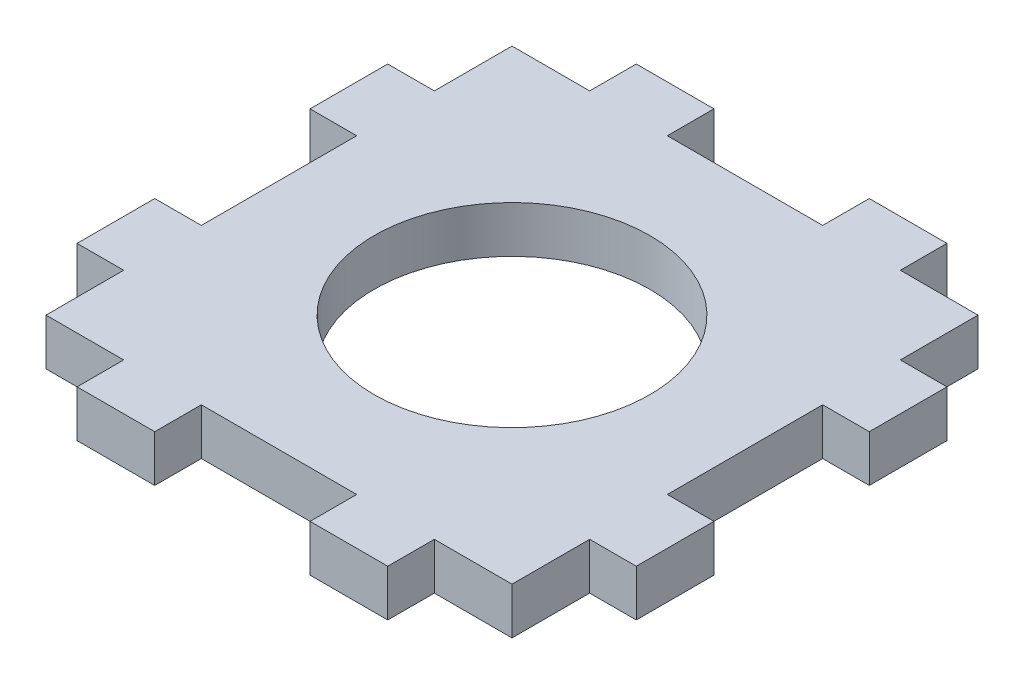
ISO-10303-21;
HEADER;
FILE_DESCRIPTION(('STEP AP214'),'2;1');
FILE_NAME('part.step','',(''),(''),'','','');
FILE_SCHEMA(('AUTOMOTIVE_DESIGN { 1 0 10303 214 1 1 1 1 }'));
ENDSEC;
DATA;
#1=APPLICATION_CONTEXT('core data for automotive mechanical design processes');
#2=APPLICATION_PROTOCOL_DEFINITION('international standard','automotive_design',2000,#1);
#3=PRODUCT_CONTEXT('',#1,'mechanical');
#4=PRODUCT('Part','Part','',(#3));
#5=PRODUCT_RELATED_PRODUCT_CATEGORY('part','',(#4));
#6=PRODUCT_DEFINITION_FORMATION('','',#4);
#7=PRODUCT_DEFINITION_CONTEXT('part definition',#1,'design');
#8=PRODUCT_DEFINITION('design','',#6,#7);
#9=PRODUCT_DEFINITION_SHAPE('','',#8);
#10=(LENGTH_UNIT() NAMED_UNIT(*) SI_UNIT(.MILLI.,.METRE.));
#11=(NAMED_UNIT(*) PLANE_ANGLE_UNIT() SI_UNIT($,.RADIAN.));
#12=(NAMED_UNIT(*) SI_UNIT($,.STERADIAN.) SOLID_ANGLE_UNIT());
#13=UNCERTAINTY_MEASURE_WITH_UNIT(LENGTH_MEASURE(1.E-05),#10,'distance_accuracy_value','');
#14=(GEOMETRIC_REPRESENTATION_CONTEXT(3) GLOBAL_UNCERTAINTY_ASSIGNED_CONTEXT((#13)) GLOBAL_UNIT_ASSIGNED_CONTEXT((#10,
#11,#12)) REPRESENTATION_CONTEXT('',''));
#15=CARTESIAN_POINT('',(0.,0.,0.));
#16=DIRECTION('',(0.,0.,1.));
#17=DIRECTION('',(1.,0.,0.));
#18=AXIS2_PLACEMENT_3D('',#15,#16,#17);
#19=CARTESIAN_POINT('',(30.,6.,0.));
#20=DIRECTION('',(1.,0.,0.));
#21=DIRECTION('',(0.,0.,-1.));
#22=AXIS2_PLACEMENT_3D('',#19,#20,#21);
#23=PLANE('',#22);
#24=DIRECTION('',(0.,0.,1.));
#25=VECTOR('',#24,1.);
#26=CARTESIAN_POINT('',(30.,0.,0.));
#27=LINE('',#26,#25);
#28=CARTESIAN_POINT('',(30.,0.,-30.));
#29=VERTEX_POINT('',#28);
#30=CARTESIAN_POINT('',(30.,0.,-19.9999999999997));
#31=VERTEX_POINT('',#30);
#32=EDGE_CURVE('E302',#29,#31,#27,.T.);
#33=ORIENTED_EDGE('',*,*,#32,.F.);
#34=DIRECTION('',(0.,-1.,0.));
#35=VECTOR('',#34,1.);
#36=CARTESIAN_POINT('',(30.,6.,-30.));
#37=LINE('',#36,#35);
#38=CARTESIAN_POINT('',(30.,6.,-30.));
#39=VERTEX_POINT('',#38);
#40=EDGE_CURVE('E11',#39,#29,#37,.T.);
#41=ORIENTED_EDGE('',*,*,#40,.F.);
#42=DIRECTION('',(0.,0.,1.));
#43=VECTOR('',#42,1.);
#44=CARTESIAN_POINT('',(30.,6.,0.));
#45=LINE('',#44,#43);
#46=CARTESIAN_POINT('',(30.,6.,-19.9999999999997));
#47=VERTEX_POINT('',#46);
#48=EDGE_CURVE('E611',#39,#47,#45,.T.);
#49=ORIENTED_EDGE('',*,*,#48,.T.);
#50=DIRECTION('',(0.,-1.,0.));
#51=VECTOR('',#50,1.);
#52=CARTESIAN_POINT('',(30.,6.,-19.9999999999997));
#53=LINE('',#52,#51);
#54=EDGE_CURVE('E54',#47,#31,#53,.T.);
#55=ORIENTED_EDGE('',*,*,#54,.T.);
#56=EDGE_LOOP('',(#33,#41,#49,#55));
#57=FACE_BOUND('',#56,.T.);
#58=ADVANCED_FACE('F37',(#57),#23,.T.);
#59=CARTESIAN_POINT('',(0.,6.,-30.));
#60=DIRECTION('',(0.,0.,-1.));
#61=DIRECTION('',(-1.,0.,0.));
#62=AXIS2_PLACEMENT_3D('',#59,#60,#61);
#63=PLANE('',#62);
#64=DIRECTION('',(1.,0.,0.));
#65=VECTOR('',#64,1.);
#66=CARTESIAN_POINT('',(0.,0.,-30.));
#67=LINE('',#66,#65);
#68=CARTESIAN_POINT('',(20.0000000000002,0.,-30.));
#69=VERTEX_POINT('',#68);
#70=EDGE_CURVE('E304',#69,#29,#67,.T.);
#71=ORIENTED_EDGE('',*,*,#70,.F.);
#72=DIRECTION('',(0.,-1.,0.));
#73=VECTOR('',#72,1.);
#74=CARTESIAN_POINT('',(20.0000000000002,6.,-30.));
#75=LINE('',#74,#73);
#76=CARTESIAN_POINT('',(20.0000000000002,6.,-30.));
#77=VERTEX_POINT('',#76);
#78=EDGE_CURVE('E46',#77,#69,#75,.T.);
#79=ORIENTED_EDGE('',*,*,#78,.F.);
#80=DIRECTION('',(1.,0.,0.));
#81=VECTOR('',#80,1.);
#82=CARTESIAN_POINT('',(0.,6.,-30.));
#83=LINE('',#82,#81);
#84=EDGE_CURVE('E476',#77,#39,#83,.T.);
#85=ORIENTED_EDGE('',*,*,#84,.T.);
#86=ORIENTED_EDGE('',*,*,#40,.T.);
#87=EDGE_LOOP('',(#71,#79,#85,#86));
#88=FACE_BOUND('',#87,.T.);
#89=ADVANCED_FACE('F475',(#88),#63,.T.);
#90=CARTESIAN_POINT('',(19.9999999999992,6.,6.93889390390704E-13));
#91=DIRECTION('',(-1.,0.,0.));
#92=DIRECTION('',(0.,0.,1.));
#93=AXIS2_PLACEMENT_3D('',#90,#91,#92);
#94=PLANE('',#93);
#95=DIRECTION('',(0.,0.,-1.));
#96=VECTOR('',#95,1.);
#97=CARTESIAN_POINT('',(19.9999999999992,0.,6.93889390390704E-13));
#98=LINE('',#97,#96);
#99=CARTESIAN_POINT('',(20.0000000000004,0.,-35.9999999999998));
#100=VERTEX_POINT('',#99);
#101=EDGE_CURVE('E309',#69,#100,#98,.T.);
#102=ORIENTED_EDGE('',*,*,#101,.T.);
#103=DIRECTION('',(0.,-1.,0.));
#104=VECTOR('',#103,1.);
#105=CARTESIAN_POINT('',(20.0000000000004,6.,-35.9999999999998));
#106=LINE('',#105,#104);
#107=CARTESIAN_POINT('',(20.0000000000004,6.,-35.9999999999998));
#108=VERTEX_POINT('',#107);
#109=EDGE_CURVE('E460',#108,#100,#106,.T.);
#110=ORIENTED_EDGE('',*,*,#109,.F.);
#111=DIRECTION('',(0.,0.,-1.));
#112=VECTOR('',#111,1.);
#113=CARTESIAN_POINT('',(19.9999999999992,6.,6.93889390390704E-13));
#114=LINE('',#113,#112);
#115=EDGE_CURVE('E468',#77,#108,#114,.T.);
#116=ORIENTED_EDGE('',*,*,#115,.F.);
#117=ORIENTED_EDGE('',*,*,#78,.T.);
#118=EDGE_LOOP('',(#102,#110,#116,#117));
#119=FACE_BOUND('',#118,.T.);
#120=ADVANCED_FACE('F465',(#119),#94,.F.);
#121=CARTESIAN_POINT('',(0.,6.,-35.9999999999998));
#122=DIRECTION('',(0.,0.,1.));
#123=DIRECTION('',(1.,0.,0.));
#124=AXIS2_PLACEMENT_3D('',#121,#122,#123);
#125=PLANE('',#124);
#126=DIRECTION('',(-1.,0.,0.));
#127=VECTOR('',#126,1.);
#128=CARTESIAN_POINT('',(0.,0.,-35.9999999999998));
#129=LINE('',#128,#127);
#130=CARTESIAN_POINT('',(10.0000000000004,0.,-35.9999999999998));
#131=VERTEX_POINT('',#130);
#132=EDGE_CURVE('E314',#100,#131,#129,.T.);
#133=ORIENTED_EDGE('',*,*,#132,.T.);
#134=DIRECTION('',(0.,-1.,0.));
#135=VECTOR('',#134,1.);
#136=CARTESIAN_POINT('',(10.0000000000004,6.,-35.9999999999998));
#137=LINE('',#136,#135);
#138=CARTESIAN_POINT('',(10.0000000000004,6.,-35.9999999999998));
#139=VERTEX_POINT('',#138);
#140=EDGE_CURVE('E458',#139,#131,#137,.T.);
#141=ORIENTED_EDGE('',*,*,#140,.F.);
#142=DIRECTION('',(-1.,0.,0.));
#143=VECTOR('',#142,1.);
#144=CARTESIAN_POINT('',(0.,6.,-35.9999999999998));
#145=LINE('',#144,#143);
#146=EDGE_CURVE('E608',#108,#139,#145,.T.);
#147=ORIENTED_EDGE('',*,*,#146,.F.);
#148=ORIENTED_EDGE('',*,*,#109,.T.);
#149=EDGE_LOOP('',(#133,#141,#147,#148));
#150=FACE_BOUND('',#149,.T.);
#151=ADVANCED_FACE('F607',(#150),#125,.F.);
#152=CARTESIAN_POINT('',(9.99999999999917,6.,3.44053489402047E-13));
#153=DIRECTION('',(-1.,0.,0.));
#154=DIRECTION('',(0.,0.,1.));
#155=AXIS2_PLACEMENT_3D('',#152,#153,#154);
#156=PLANE('',#155);
#157=DIRECTION('',(0.,0.,-1.));
#158=VECTOR('',#157,1.);
#159=CARTESIAN_POINT('',(9.99999999999917,0.,3.44053489402047E-13));
#160=LINE('',#159,#158);
#161=CARTESIAN_POINT('',(10.0000000000002,0.,-30.));
#162=VERTEX_POINT('',#161);
#163=EDGE_CURVE('E317',#162,#131,#160,.T.);
#164=ORIENTED_EDGE('',*,*,#163,.F.);
#165=DIRECTION('',(0.,-1.,0.));
#166=VECTOR('',#165,1.);
#167=CARTESIAN_POINT('',(10.0000000000002,6.,-30.));
#168=LINE('',#167,#166);
#169=CARTESIAN_POINT('',(10.0000000000002,6.,-30.));
#170=VERTEX_POINT('',#169);
#171=EDGE_CURVE('E456',#170,#162,#168,.T.);
#172=ORIENTED_EDGE('',*,*,#171,.F.);
#173=DIRECTION('',(0.,0.,-1.));
#174=VECTOR('',#173,1.);
#175=CARTESIAN_POINT('',(9.99999999999917,6.,3.44053489402047E-13));
#176=LINE('',#175,#174);
#177=EDGE_CURVE('E605',#170,#139,#176,.T.);
#178=ORIENTED_EDGE('',*,*,#177,.T.);
#179=ORIENTED_EDGE('',*,*,#140,.T.);
#180=EDGE_LOOP('',(#164,#172,#178,#179));
#181=FACE_BOUND('',#180,.T.);
#182=ADVANCED_FACE('F603',(#181),#156,.T.);
#183=CARTESIAN_POINT('',(-9.99999999999969,0.,-30.));
#184=VERTEX_POINT('',#183);
#185=EDGE_CURVE('E311',#184,#162,#67,.T.);
#186=ORIENTED_EDGE('',*,*,#185,.F.);
#187=DIRECTION('',(0.,-1.,0.));
#188=VECTOR('',#187,1.);
#189=CARTESIAN_POINT('',(-9.99999999999969,6.,-30.));
#190=LINE('',#189,#188);
#191=CARTESIAN_POINT('',(-9.99999999999969,6.,-30.));
#192=VERTEX_POINT('',#191);
#193=EDGE_CURVE('E454',#192,#184,#190,.T.);
#194=ORIENTED_EDGE('',*,*,#193,.F.);
#195=EDGE_CURVE('E599',#192,#170,#83,.T.);
#196=ORIENTED_EDGE('',*,*,#195,.T.);
#197=ORIENTED_EDGE('',*,*,#171,.T.);
#198=EDGE_LOOP('',(#186,#194,#196,#197));
#199=FACE_BOUND('',#198,.T.);
#200=ADVANCED_FACE('F497',(#199),#63,.T.);
#201=CARTESIAN_POINT('',(-10.0000000000007,6.,-3.15141431469159E-13));
#202=DIRECTION('',(-1.,0.,0.));
#203=DIRECTION('',(0.,0.,1.));
#204=AXIS2_PLACEMENT_3D('',#201,#202,#203);
#205=PLANE('',#204);
#206=DIRECTION('',(0.,0.,-1.));
#207=VECTOR('',#206,1.);
#208=CARTESIAN_POINT('',(-10.0000000000007,0.,-3.15141431469159E-13));
#209=LINE('',#208,#207);
#210=CARTESIAN_POINT('',(-9.9999999999996,0.,-35.9999999999998));
#211=VERTEX_POINT('',#210);
#212=EDGE_CURVE('E320',#184,#211,#209,.T.);
#213=ORIENTED_EDGE('',*,*,#212,.T.);
#214=DIRECTION('',(0.,-1.,0.));
#215=VECTOR('',#214,1.);
#216=CARTESIAN_POINT('',(-9.9999999999996,6.,-35.9999999999998));
#217=LINE('',#216,#215);
#218=CARTESIAN_POINT('',(-9.9999999999996,6.,-35.9999999999998));
#219=VERTEX_POINT('',#218);
#220=EDGE_CURVE('E452',#219,#211,#217,.T.);
#221=ORIENTED_EDGE('',*,*,#220,.F.);
#222=DIRECTION('',(0.,0.,-1.));
#223=VECTOR('',#222,1.);
#224=CARTESIAN_POINT('',(-10.0000000000007,6.,-3.15141431469159E-13));
#225=LINE('',#224,#223);
#226=EDGE_CURVE('E616',#192,#219,#225,.T.);
#227=ORIENTED_EDGE('',*,*,#226,.F.);
#228=ORIENTED_EDGE('',*,*,#193,.T.);
#229=EDGE_LOOP('',(#213,#221,#227,#228));
#230=FACE_BOUND('',#229,.T.);
#231=ADVANCED_FACE('F932',(#230),#205,.F.);
#232=CARTESIAN_POINT('',(0.,6.,-35.9999999999998));
#233=DIRECTION('',(0.,0.,-1.));
#234=DIRECTION('',(-1.,0.,0.));
#235=AXIS2_PLACEMENT_3D('',#232,#233,#234);
#236=PLANE('',#235);
#237=DIRECTION('',(1.,0.,0.));
#238=VECTOR('',#237,1.);
#239=CARTESIAN_POINT('',(0.,0.,-35.9999999999998));
#240=LINE('',#239,#238);
#241=CARTESIAN_POINT('',(-19.9999999999996,0.,-35.9999999999998));
#242=VERTEX_POINT('',#241);
#243=EDGE_CURVE('E323',#242,#211,#240,.T.);
#244=ORIENTED_EDGE('',*,*,#243,.F.);
#245=DIRECTION('',(0.,-1.,0.));
#246=VECTOR('',#245,1.);
#247=CARTESIAN_POINT('',(-19.9999999999996,6.,-35.9999999999998));
#248=LINE('',#247,#246);
#249=CARTESIAN_POINT('',(-19.9999999999996,6.,-35.9999999999998));
#250=VERTEX_POINT('',#249);
#251=EDGE_CURVE('E450',#250,#242,#248,.T.);
#252=ORIENTED_EDGE('',*,*,#251,.F.);
#253=DIRECTION('',(1.,0.,0.));
#254=VECTOR('',#253,1.);
#255=CARTESIAN_POINT('',(0.,6.,-35.9999999999998));
#256=LINE('',#255,#254);
#257=EDGE_CURVE('E618',#250,#219,#256,.T.);
#258=ORIENTED_EDGE('',*,*,#257,.T.);
#259=ORIENTED_EDGE('',*,*,#220,.T.);
#260=EDGE_LOOP('',(#244,#252,#258,#259));
#261=FACE_BOUND('',#260,.T.);
#262=ADVANCED_FACE('F921',(#261),#236,.T.);
#263=CARTESIAN_POINT('',(-20.0000000000008,6.,-6.47630097698073E-13));
#264=DIRECTION('',(-1.,0.,0.));
#265=DIRECTION('',(0.,0.,1.));
#266=AXIS2_PLACEMENT_3D('',#263,#264,#265);
#267=PLANE('',#266);
#268=DIRECTION('',(0.,0.,-1.));
#269=VECTOR('',#268,1.);
#270=CARTESIAN_POINT('',(-20.0000000000008,0.,-6.47630097698073E-13));
#271=LINE('',#270,#269);
#272=CARTESIAN_POINT('',(-19.9999999999997,0.,-30.));
#273=VERTEX_POINT('',#272);
#274=EDGE_CURVE('E326',#273,#242,#271,.T.);
#275=ORIENTED_EDGE('',*,*,#274,.F.);
#276=DIRECTION('',(0.,-1.,0.));
#277=VECTOR('',#276,1.);
#278=CARTESIAN_POINT('',(-19.9999999999997,6.,-30.));
#279=LINE('',#278,#277);
#280=CARTESIAN_POINT('',(-19.9999999999997,6.,-30.));
#281=VERTEX_POINT('',#280);
#282=EDGE_CURVE('E448',#281,#273,#279,.T.);
#283=ORIENTED_EDGE('',*,*,#282,.F.);
#284=DIRECTION('',(0.,0.,-1.));
#285=VECTOR('',#284,1.);
#286=CARTESIAN_POINT('',(-20.0000000000008,6.,-6.47630097698073E-13));
#287=LINE('',#286,#285);
#288=EDGE_CURVE('E621',#281,#250,#287,.T.);
#289=ORIENTED_EDGE('',*,*,#288,.T.);
#290=ORIENTED_EDGE('',*,*,#251,.T.);
#291=EDGE_LOOP('',(#275,#283,#289,#290));
#292=FACE_BOUND('',#291,.T.);
#293=ADVANCED_FACE('F911',(#292),#267,.T.);
#294=CARTESIAN_POINT('',(-30.,0.,-30.));
#295=VERTEX_POINT('',#294);
#296=EDGE_CURVE('E310',#295,#273,#67,.T.);
#297=ORIENTED_EDGE('',*,*,#296,.F.);
#298=DIRECTION('',(0.,-1.,0.));
#299=VECTOR('',#298,1.);
#300=CARTESIAN_POINT('',(-30.,6.,-30.));
#301=LINE('',#300,#299);
#302=CARTESIAN_POINT('',(-30.,6.,-30.));
#303=VERTEX_POINT('',#302);
#304=EDGE_CURVE('E446',#303,#295,#301,.T.);
#305=ORIENTED_EDGE('',*,*,#304,.F.);
#306=EDGE_CURVE('E589',#303,#281,#83,.T.);
#307=ORIENTED_EDGE('',*,*,#306,.T.);
#308=ORIENTED_EDGE('',*,*,#282,.T.);
#309=EDGE_LOOP('',(#297,#305,#307,#308));
#310=FACE_BOUND('',#309,.T.);
#311=ADVANCED_FACE('F498',(#310),#63,.T.);
#312=CARTESIAN_POINT('',(-30.,6.,0.));
#313=DIRECTION('',(1.,0.,0.));
#314=DIRECTION('',(0.,0.,-1.));
#315=AXIS2_PLACEMENT_3D('',#312,#313,#314);
#316=PLANE('',#315);
#317=DIRECTION('',(0.,0.,1.));
#318=VECTOR('',#317,1.);
#319=CARTESIAN_POINT('',(-30.,0.,0.));
#320=LINE('',#319,#318);
#321=CARTESIAN_POINT('',(-30.,0.,-20.0000000000001));
#322=VERTEX_POINT('',#321);
#323=EDGE_CURVE('E329',#295,#322,#320,.T.);
#324=ORIENTED_EDGE('',*,*,#323,.T.);
#325=DIRECTION('',(0.,-1.,0.));
#326=VECTOR('',#325,1.);
#327=CARTESIAN_POINT('',(-30.,6.,-20.0000000000001));
#328=LINE('',#327,#326);
#329=CARTESIAN_POINT('',(-30.,6.,-20.0000000000001));
#330=VERTEX_POINT('',#329);
#331=EDGE_CURVE('E443',#330,#322,#328,.T.);
#332=ORIENTED_EDGE('',*,*,#331,.F.);
#333=DIRECTION('',(0.,0.,1.));
#334=VECTOR('',#333,1.);
#335=CARTESIAN_POINT('',(-30.,6.,0.));
#336=LINE('',#335,#334);
#337=EDGE_CURVE('E585',#303,#330,#336,.T.);
#338=ORIENTED_EDGE('',*,*,#337,.F.);
#339=ORIENTED_EDGE('',*,*,#304,.T.);
#340=EDGE_LOOP('',(#324,#332,#338,#339));
#341=FACE_BOUND('',#340,.T.);
#342=ADVANCED_FACE('F584',(#341),#316,.F.);
#343=CARTESIAN_POINT('',(0.,6.,-20.0000000000002));
#344=DIRECTION('',(0.,0.,1.));
#345=DIRECTION('',(1.,0.,0.));
#346=AXIS2_PLACEMENT_3D('',#343,#344,#345);
#347=PLANE('',#346);
#348=DIRECTION('',(-1.,0.,0.));
#349=VECTOR('',#348,1.);
#350=CARTESIAN_POINT('',(0.,0.,-20.0000000000002));
#351=LINE('',#350,#349);
#352=CARTESIAN_POINT('',(-35.9999999999997,0.,-20.0000000000001));
#353=VERTEX_POINT('',#352);
#354=EDGE_CURVE('E332',#322,#353,#351,.T.);
#355=ORIENTED_EDGE('',*,*,#354,.T.);
#356=DIRECTION('',(0.,-1.,0.));
#357=VECTOR('',#356,1.);
#358=CARTESIAN_POINT('',(-35.9999999999997,6.,-20.0000000000001));
#359=LINE('',#358,#357);
#360=CARTESIAN_POINT('',(-35.9999999999997,6.,-20.0000000000001));
#361=VERTEX_POINT('',#360);
#362=EDGE_CURVE('E440',#361,#353,#359,.T.);
#363=ORIENTED_EDGE('',*,*,#362,.F.);
#364=DIRECTION('',(-1.,0.,0.));
#365=VECTOR('',#364,1.);
#366=CARTESIAN_POINT('',(0.,6.,-20.0000000000002));
#367=LINE('',#366,#365);
#368=EDGE_CURVE('E580',#330,#361,#367,.T.);
#369=ORIENTED_EDGE('',*,*,#368,.F.);
#370=ORIENTED_EDGE('',*,*,#331,.T.);
#371=EDGE_LOOP('',(#355,#363,#369,#370));
#372=FACE_BOUND('',#371,.T.);
#373=ADVANCED_FACE('F578',(#372),#347,.F.);
#374=CARTESIAN_POINT('',(-35.9999999999997,6.,0.));
#375=DIRECTION('',(1.,0.,0.));
#376=DIRECTION('',(0.,0.,-1.));
#377=AXIS2_PLACEMENT_3D('',#374,#375,#376);
#378=PLANE('',#377);
#379=DIRECTION('',(0.,0.,1.));
#380=VECTOR('',#379,1.);
#381=CARTESIAN_POINT('',(-35.9999999999997,0.,0.));
#382=LINE('',#381,#380);
#383=CARTESIAN_POINT('',(-35.9999999999997,0.,-10.0000000000001));
#384=VERTEX_POINT('',#383);
#385=EDGE_CURVE('E337',#353,#384,#382,.T.);
#386=ORIENTED_EDGE('',*,*,#385,.T.);
#387=DIRECTION('',(0.,-1.,0.));
#388=VECTOR('',#387,1.);
#389=CARTESIAN_POINT('',(-35.9999999999997,6.,-10.0000000000001));
#390=LINE('',#389,#388);
#391=CARTESIAN_POINT('',(-35.9999999999997,6.,-10.0000000000001));
#392=VERTEX_POINT('',#391);
#393=EDGE_CURVE('E438',#392,#384,#390,.T.);
#394=ORIENTED_EDGE('',*,*,#393,.F.);
#395=DIRECTION('',(0.,0.,1.));
#396=VECTOR('',#395,1.);
#397=CARTESIAN_POINT('',(-35.9999999999997,6.,0.));
#398=LINE('',#397,#396);
#399=EDGE_CURVE('E628',#361,#392,#398,.T.);
#400=ORIENTED_EDGE('',*,*,#399,.F.);
#401=ORIENTED_EDGE('',*,*,#362,.T.);
#402=EDGE_LOOP('',(#386,#394,#400,#401));
#403=FACE_BOUND('',#402,.T.);
#404=ADVANCED_FACE('F571',(#403),#378,.F.);
#405=CARTESIAN_POINT('',(0.,6.,-10.0000000000002));
#406=DIRECTION('',(0.,0.,1.));
#407=DIRECTION('',(1.,0.,0.));
#408=AXIS2_PLACEMENT_3D('',#405,#406,#407);
#409=PLANE('',#408);
#410=DIRECTION('',(-1.,0.,0.));
#411=VECTOR('',#410,1.);
#412=CARTESIAN_POINT('',(0.,0.,-10.0000000000002));
#413=LINE('',#412,#411);
#414=CARTESIAN_POINT('',(-30.,0.,-10.0000000000001));
#415=VERTEX_POINT('',#414);
#416=EDGE_CURVE('E340',#415,#384,#413,.T.);
#417=ORIENTED_EDGE('',*,*,#416,.F.);
#418=DIRECTION('',(0.,-1.,0.));
#419=VECTOR('',#418,1.);
#420=CARTESIAN_POINT('',(-30.,6.,-10.0000000000001));
#421=LINE('',#420,#419);
#422=CARTESIAN_POINT('',(-30.,6.,-10.0000000000001));
#423=VERTEX_POINT('',#422);
#424=EDGE_CURVE('E436',#423,#415,#421,.T.);
#425=ORIENTED_EDGE('',*,*,#424,.F.);
#426=DIRECTION('',(-1.,0.,0.));
#427=VECTOR('',#426,1.);
#428=CARTESIAN_POINT('',(0.,6.,-10.0000000000002));
#429=LINE('',#428,#427);
#430=EDGE_CURVE('E569',#423,#392,#429,.T.);
#431=ORIENTED_EDGE('',*,*,#430,.T.);
#432=ORIENTED_EDGE('',*,*,#393,.T.);
#433=EDGE_LOOP('',(#417,#425,#431,#432));
#434=FACE_BOUND('',#433,.T.);
#435=ADVANCED_FACE('F565',(#434),#409,.T.);
#436=CARTESIAN_POINT('',(-30.,0.,9.9999999999999));
#437=VERTEX_POINT('',#436);
#438=EDGE_CURVE('E334',#415,#437,#320,.T.);
#439=ORIENTED_EDGE('',*,*,#438,.T.);
#440=DIRECTION('',(0.,-1.,0.));
#441=VECTOR('',#440,1.);
#442=CARTESIAN_POINT('',(-30.,6.,9.9999999999999));
#443=LINE('',#442,#441);
#444=CARTESIAN_POINT('',(-30.,6.,9.9999999999999));
#445=VERTEX_POINT('',#444);
#446=EDGE_CURVE('E433',#445,#437,#443,.T.);
#447=ORIENTED_EDGE('',*,*,#446,.F.);
#448=EDGE_CURVE('E626',#423,#445,#336,.T.);
#449=ORIENTED_EDGE('',*,*,#448,.F.);
#450=ORIENTED_EDGE('',*,*,#424,.T.);
#451=EDGE_LOOP('',(#439,#447,#449,#450));
#452=FACE_BOUND('',#451,.T.);
#453=ADVANCED_FACE('F561',(#452),#316,.F.);
#454=CARTESIAN_POINT('',(0.,6.,9.99999999999974));
#455=DIRECTION('',(0.,0.,1.));
#456=DIRECTION('',(1.,0.,0.));
#457=AXIS2_PLACEMENT_3D('',#454,#455,#456);
#458=PLANE('',#457);
#459=DIRECTION('',(-1.,0.,0.));
#460=VECTOR('',#459,1.);
#461=CARTESIAN_POINT('',(0.,0.,9.99999999999974));
#462=LINE('',#461,#460);
#463=CARTESIAN_POINT('',(-35.9999999999997,0.,9.99999999999992));
#464=VERTEX_POINT('',#463);
#465=EDGE_CURVE('E343',#437,#464,#462,.T.);
#466=ORIENTED_EDGE('',*,*,#465,.T.);
#467=DIRECTION('',(0.,-1.,0.));
#468=VECTOR('',#467,1.);
#469=CARTESIAN_POINT('',(-35.9999999999997,6.,9.99999999999992));
#470=LINE('',#469,#468);
#471=CARTESIAN_POINT('',(-35.9999999999997,6.,9.99999999999992));
#472=VERTEX_POINT('',#471);
#473=EDGE_CURVE('E431',#472,#464,#470,.T.);
#474=ORIENTED_EDGE('',*,*,#473,.F.);
#475=DIRECTION('',(-1.,0.,0.));
#476=VECTOR('',#475,1.);
#477=CARTESIAN_POINT('',(0.,6.,9.99999999999974));
#478=LINE('',#477,#476);
#479=EDGE_CURVE('E631',#445,#472,#478,.T.);
#480=ORIENTED_EDGE('',*,*,#479,.F.);
#481=ORIENTED_EDGE('',*,*,#446,.T.);
#482=EDGE_LOOP('',(#466,#474,#480,#481));
#483=FACE_BOUND('',#482,.T.);
#484=ADVANCED_FACE('F851',(#483),#458,.F.);
#485=CARTESIAN_POINT('',(-35.9999999999997,6.,0.));
#486=DIRECTION('',(-1.,0.,0.));
#487=DIRECTION('',(0.,0.,1.));
#488=AXIS2_PLACEMENT_3D('',#485,#486,#487);
#489=PLANE('',#488);
#490=DIRECTION('',(0.,0.,-1.));
#491=VECTOR('',#490,1.);
#492=CARTESIAN_POINT('',(-35.9999999999997,0.,0.));
#493=LINE('',#492,#491);
#494=CARTESIAN_POINT('',(-35.9999999999997,0.,19.9999999999999));
#495=VERTEX_POINT('',#494);
#496=EDGE_CURVE('E346',#495,#464,#493,.T.);
#497=ORIENTED_EDGE('',*,*,#496,.F.);
#498=DIRECTION('',(0.,-1.,0.));
#499=VECTOR('',#498,1.);
#500=CARTESIAN_POINT('',(-35.9999999999997,6.,19.9999999999999));
#501=LINE('',#500,#499);
#502=CARTESIAN_POINT('',(-35.9999999999997,6.,19.9999999999999));
#503=VERTEX_POINT('',#502);
#504=EDGE_CURVE('E429',#503,#495,#501,.T.);
#505=ORIENTED_EDGE('',*,*,#504,.F.);
#506=DIRECTION('',(0.,0.,-1.));
#507=VECTOR('',#506,1.);
#508=CARTESIAN_POINT('',(-35.9999999999997,6.,0.));
#509=LINE('',#508,#507);
#510=EDGE_CURVE('E633',#503,#472,#509,.T.);
#511=ORIENTED_EDGE('',*,*,#510,.T.);
#512=ORIENTED_EDGE('',*,*,#473,.T.);
#513=EDGE_LOOP('',(#497,#505,#511,#512));
#514=FACE_BOUND('',#513,.T.);
#515=ADVANCED_FACE('F840',(#514),#489,.T.);
#516=CARTESIAN_POINT('',(0.,6.,19.9999999999998));
#517=DIRECTION('',(0.,0.,1.));
#518=DIRECTION('',(1.,0.,0.));
#519=AXIS2_PLACEMENT_3D('',#516,#517,#518);
#520=PLANE('',#519);
#521=DIRECTION('',(-1.,0.,0.));
#522=VECTOR('',#521,1.);
#523=CARTESIAN_POINT('',(0.,0.,19.9999999999998));
#524=LINE('',#523,#522);
#525=CARTESIAN_POINT('',(-30.,0.,19.9999999999999));
#526=VERTEX_POINT('',#525);
#527=EDGE_CURVE('E349',#526,#495,#524,.T.);
#528=ORIENTED_EDGE('',*,*,#527,.F.);
#529=DIRECTION('',(0.,-1.,0.));
#530=VECTOR('',#529,1.);
#531=CARTESIAN_POINT('',(-30.,6.,19.9999999999999));
#532=LINE('',#531,#530);
#533=CARTESIAN_POINT('',(-30.,6.,19.9999999999999));
#534=VERTEX_POINT('',#533);
#535=EDGE_CURVE('E427',#534,#526,#532,.T.);
#536=ORIENTED_EDGE('',*,*,#535,.F.);
#537=DIRECTION('',(-1.,0.,0.));
#538=VECTOR('',#537,1.);
#539=CARTESIAN_POINT('',(0.,6.,19.9999999999998));
#540=LINE('',#539,#538);
#541=EDGE_CURVE('E636',#534,#503,#540,.T.);
#542=ORIENTED_EDGE('',*,*,#541,.T.);
#543=ORIENTED_EDGE('',*,*,#504,.T.);
#544=EDGE_LOOP('',(#528,#536,#542,#543));
#545=FACE_BOUND('',#544,.T.);
#546=ADVANCED_FACE('F829',(#545),#520,.T.);
#547=CARTESIAN_POINT('',(-30.,0.,30.));
#548=VERTEX_POINT('',#547);
#549=EDGE_CURVE('E333',#526,#548,#320,.T.);
#550=ORIENTED_EDGE('',*,*,#549,.T.);
#551=DIRECTION('',(0.,-1.,0.));
#552=VECTOR('',#551,1.);
#553=CARTESIAN_POINT('',(-30.,6.,30.));
#554=LINE('',#553,#552);
#555=CARTESIAN_POINT('',(-30.,6.,30.));
#556=VERTEX_POINT('',#555);
#557=EDGE_CURVE('E424',#556,#548,#554,.T.);
#558=ORIENTED_EDGE('',*,*,#557,.F.);
#559=EDGE_CURVE('E625',#534,#556,#336,.T.);
#560=ORIENTED_EDGE('',*,*,#559,.F.);
#561=ORIENTED_EDGE('',*,*,#535,.T.);
#562=EDGE_LOOP('',(#550,#558,#560,#561));
#563=FACE_BOUND('',#562,.T.);
#564=ADVANCED_FACE('F555',(#563),#316,.F.);
#565=CARTESIAN_POINT('',(0.,6.,30.));
#566=DIRECTION('',(0.,0.,-1.));
#567=DIRECTION('',(-1.,0.,0.));
#568=AXIS2_PLACEMENT_3D('',#565,#566,#567);
#569=PLANE('',#568);
#570=DIRECTION('',(1.,0.,0.));
#571=VECTOR('',#570,1.);
#572=CARTESIAN_POINT('',(0.,0.,30.));
#573=LINE('',#572,#571);
#574=CARTESIAN_POINT('',(-20.,0.,30.));
#575=VERTEX_POINT('',#574);
#576=EDGE_CURVE('E352',#548,#575,#573,.T.);
#577=ORIENTED_EDGE('',*,*,#576,.T.);
#578=DIRECTION('',(0.,-1.,0.));
#579=VECTOR('',#578,1.);
#580=CARTESIAN_POINT('',(-20.,6.,30.));
#581=LINE('',#580,#579);
#582=CARTESIAN_POINT('',(-20.,6.,30.));
#583=VERTEX_POINT('',#582);
#584=EDGE_CURVE('E421',#583,#575,#581,.T.);
#585=ORIENTED_EDGE('',*,*,#584,.F.);
#586=DIRECTION('',(1.,0.,0.));
#587=VECTOR('',#586,1.);
#588=CARTESIAN_POINT('',(0.,6.,30.));
#589=LINE('',#588,#587);
#590=EDGE_CURVE('E551',#556,#583,#589,.T.);
#591=ORIENTED_EDGE('',*,*,#590,.F.);
#592=ORIENTED_EDGE('',*,*,#557,.T.);
#593=EDGE_LOOP('',(#577,#585,#591,#592));
#594=FACE_BOUND('',#593,.T.);
#595=ADVANCED_FACE('F548',(#594),#569,.F.);
#596=CARTESIAN_POINT('',(-20.,6.,0.));
#597=DIRECTION('',(1.,0.,0.));
#598=DIRECTION('',(0.,0.,-1.));
#599=AXIS2_PLACEMENT_3D('',#596,#597,#598);
#600=PLANE('',#599);
#601=DIRECTION('',(0.,0.,1.));
#602=VECTOR('',#601,1.);
#603=CARTESIAN_POINT('',(-20.,0.,0.));
#604=LINE('',#603,#602);
#605=CARTESIAN_POINT('',(-20.,0.,36.));
#606=VERTEX_POINT('',#605);
#607=EDGE_CURVE('E355',#575,#606,#604,.T.);
#608=ORIENTED_EDGE('',*,*,#607,.T.);
#609=DIRECTION('',(0.,-1.,0.));
#610=VECTOR('',#609,1.);
#611=CARTESIAN_POINT('',(-20.,6.,36.));
#612=LINE('',#611,#610);
#613=CARTESIAN_POINT('',(-20.,6.,36.));
#614=VERTEX_POINT('',#613);
#615=EDGE_CURVE('E418',#614,#606,#612,.T.);
#616=ORIENTED_EDGE('',*,*,#615,.F.);
#617=DIRECTION('',(0.,0.,1.));
#618=VECTOR('',#617,1.);
#619=CARTESIAN_POINT('',(-20.,6.,0.));
#620=LINE('',#619,#618);
#621=EDGE_CURVE('E545',#583,#614,#620,.T.);
#622=ORIENTED_EDGE('',*,*,#621,.F.);
#623=ORIENTED_EDGE('',*,*,#584,.T.);
#624=EDGE_LOOP('',(#608,#616,#622,#623));
#625=FACE_BOUND('',#624,.T.);
#626=ADVANCED_FACE('F543',(#625),#600,.F.);
#627=CARTESIAN_POINT('',(0.,6.,36.));
#628=DIRECTION('',(0.,0.,-1.));
#629=DIRECTION('',(-1.,0.,0.));
#630=AXIS2_PLACEMENT_3D('',#627,#628,#629);
#631=PLANE('',#630);
#632=DIRECTION('',(1.,0.,0.));
#633=VECTOR('',#632,1.);
#634=CARTESIAN_POINT('',(0.,0.,36.));
#635=LINE('',#634,#633);
#636=CARTESIAN_POINT('',(-9.99999999999999,0.,36.));
#637=VERTEX_POINT('',#636);
#638=EDGE_CURVE('E360',#606,#637,#635,.T.);
#639=ORIENTED_EDGE('',*,*,#638,.T.);
#640=DIRECTION('',(0.,-1.,0.));
#641=VECTOR('',#640,1.);
#642=CARTESIAN_POINT('',(-9.99999999999999,6.,36.));
#643=LINE('',#642,#641);
#644=CARTESIAN_POINT('',(-9.99999999999999,6.,36.));
#645=VERTEX_POINT('',#644);
#646=EDGE_CURVE('E416',#645,#637,#643,.T.);
#647=ORIENTED_EDGE('',*,*,#646,.F.);
#648=DIRECTION('',(1.,0.,0.));
#649=VECTOR('',#648,1.);
#650=CARTESIAN_POINT('',(0.,6.,36.));
#651=LINE('',#650,#649);
#652=EDGE_CURVE('E643',#614,#645,#651,.T.);
#653=ORIENTED_EDGE('',*,*,#652,.F.);
#654=ORIENTED_EDGE('',*,*,#615,.T.);
#655=EDGE_LOOP('',(#639,#647,#653,#654));
#656=FACE_BOUND('',#655,.T.);
#657=ADVANCED_FACE('F538',(#656),#631,.F.);
#658=CARTESIAN_POINT('',(-9.99999999999999,6.,0.));
#659=DIRECTION('',(1.,0.,0.));
#660=DIRECTION('',(0.,0.,-1.));
#661=AXIS2_PLACEMENT_3D('',#658,#659,#660);
#662=PLANE('',#661);
#663=DIRECTION('',(0.,0.,1.));
#664=VECTOR('',#663,1.);
#665=CARTESIAN_POINT('',(-9.99999999999999,0.,0.));
#666=LINE('',#665,#664);
#667=CARTESIAN_POINT('',(-9.99999999999999,0.,30.));
#668=VERTEX_POINT('',#667);
#669=EDGE_CURVE('E363',#668,#637,#666,.T.);
#670=ORIENTED_EDGE('',*,*,#669,.F.);
#671=DIRECTION('',(0.,-1.,0.));
#672=VECTOR('',#671,1.);
#673=CARTESIAN_POINT('',(-9.99999999999999,6.,30.));
#674=LINE('',#673,#672);
#675=CARTESIAN_POINT('',(-9.99999999999999,6.,30.));
#676=VERTEX_POINT('',#675);
#677=EDGE_CURVE('E414',#676,#668,#674,.T.);
#678=ORIENTED_EDGE('',*,*,#677,.F.);
#679=DIRECTION('',(0.,0.,1.));
#680=VECTOR('',#679,1.);
#681=CARTESIAN_POINT('',(-9.99999999999999,6.,0.));
#682=LINE('',#681,#680);
#683=EDGE_CURVE('E536',#676,#645,#682,.T.);
#684=ORIENTED_EDGE('',*,*,#683,.T.);
#685=ORIENTED_EDGE('',*,*,#646,.T.);
#686=EDGE_LOOP('',(#670,#678,#684,#685));
#687=FACE_BOUND('',#686,.T.);
#688=ADVANCED_FACE('F532',(#687),#662,.T.);
#689=CARTESIAN_POINT('',(10.,0.,30.));
#690=VERTEX_POINT('',#689);
#691=EDGE_CURVE('E357',#668,#690,#573,.T.);
#692=ORIENTED_EDGE('',*,*,#691,.T.);
#693=DIRECTION('',(0.,-1.,0.));
#694=VECTOR('',#693,1.);
#695=CARTESIAN_POINT('',(10.,6.,30.));
#696=LINE('',#695,#694);
#697=CARTESIAN_POINT('',(10.,6.,30.));
#698=VERTEX_POINT('',#697);
#699=EDGE_CURVE('E411',#698,#690,#696,.T.);
#700=ORIENTED_EDGE('',*,*,#699,.F.);
#701=EDGE_CURVE('E641',#676,#698,#589,.T.);
#702=ORIENTED_EDGE('',*,*,#701,.F.);
#703=ORIENTED_EDGE('',*,*,#677,.T.);
#704=EDGE_LOOP('',(#692,#700,#702,#703));
#705=FACE_BOUND('',#704,.T.);
#706=ADVANCED_FACE('F528',(#705),#569,.F.);
#707=CARTESIAN_POINT('',(9.99999999999991,6.,0.));
#708=DIRECTION('',(1.,0.,0.));
#709=DIRECTION('',(0.,0.,-1.));
#710=AXIS2_PLACEMENT_3D('',#707,#708,#709);
#711=PLANE('',#710);
#712=DIRECTION('',(0.,0.,1.));
#713=VECTOR('',#712,1.);
#714=CARTESIAN_POINT('',(9.99999999999991,0.,0.));
#715=LINE('',#714,#713);
#716=CARTESIAN_POINT('',(10.,0.,36.));
#717=VERTEX_POINT('',#716);
#718=EDGE_CURVE('E366',#690,#717,#715,.T.);
#719=ORIENTED_EDGE('',*,*,#718,.T.);
#720=DIRECTION('',(0.,-1.,0.));
#721=VECTOR('',#720,1.);
#722=CARTESIAN_POINT('',(10.,6.,36.));
#723=LINE('',#722,#721);
#724=CARTESIAN_POINT('',(10.,6.,36.));
#725=VERTEX_POINT('',#724);
#726=EDGE_CURVE('E409',#725,#717,#723,.T.);
#727=ORIENTED_EDGE('',*,*,#726,.F.);
#728=DIRECTION('',(0.,0.,1.));
#729=VECTOR('',#728,1.);
#730=CARTESIAN_POINT('',(9.99999999999991,6.,0.));
#731=LINE('',#730,#729);
#732=EDGE_CURVE('E646',#698,#725,#731,.T.);
#733=ORIENTED_EDGE('',*,*,#732,.F.);
#734=ORIENTED_EDGE('',*,*,#699,.T.);
#735=EDGE_LOOP('',(#719,#727,#733,#734));
#736=FACE_BOUND('',#735,.T.);
#737=ADVANCED_FACE('F769',(#736),#711,.F.);
#738=CARTESIAN_POINT('',(0.,6.,36.));
#739=DIRECTION('',(0.,0.,1.));
#740=DIRECTION('',(1.,0.,0.));
#741=AXIS2_PLACEMENT_3D('',#738,#739,#740);
#742=PLANE('',#741);
#743=DIRECTION('',(-1.,0.,0.));
#744=VECTOR('',#743,1.);
#745=CARTESIAN_POINT('',(0.,0.,36.));
#746=LINE('',#745,#744);
#747=CARTESIAN_POINT('',(20.,0.,36.));
#748=VERTEX_POINT('',#747);
#749=EDGE_CURVE('E369',#748,#717,#746,.T.);
#750=ORIENTED_EDGE('',*,*,#749,.F.);
#751=DIRECTION('',(0.,-1.,0.));
#752=VECTOR('',#751,1.);
#753=CARTESIAN_POINT('',(20.,6.,36.));
#754=LINE('',#753,#752);
#755=CARTESIAN_POINT('',(20.,6.,36.));
#756=VERTEX_POINT('',#755);
#757=EDGE_CURVE('E407',#756,#748,#754,.T.);
#758=ORIENTED_EDGE('',*,*,#757,.F.);
#759=DIRECTION('',(-1.,0.,0.));
#760=VECTOR('',#759,1.);
#761=CARTESIAN_POINT('',(0.,6.,36.));
#762=LINE('',#761,#760);
#763=EDGE_CURVE('E648',#756,#725,#762,.T.);
#764=ORIENTED_EDGE('',*,*,#763,.T.);
#765=ORIENTED_EDGE('',*,*,#726,.T.);
#766=EDGE_LOOP('',(#750,#758,#764,#765));
#767=FACE_BOUND('',#766,.T.);
#768=ADVANCED_FACE('F758',(#767),#742,.T.);
#769=CARTESIAN_POINT('',(19.9999999999999,6.,0.));
#770=DIRECTION('',(1.,0.,0.));
#771=DIRECTION('',(0.,0.,-1.));
#772=AXIS2_PLACEMENT_3D('',#769,#770,#771);
#773=PLANE('',#772);
#774=DIRECTION('',(0.,0.,1.));
#775=VECTOR('',#774,1.);
#776=CARTESIAN_POINT('',(19.9999999999999,0.,0.));
#777=LINE('',#776,#775);
#778=CARTESIAN_POINT('',(20.,0.,30.));
#779=VERTEX_POINT('',#778);
#780=EDGE_CURVE('E372',#779,#748,#777,.T.);
#781=ORIENTED_EDGE('',*,*,#780,.F.);
#782=DIRECTION('',(0.,-1.,0.));
#783=VECTOR('',#782,1.);
#784=CARTESIAN_POINT('',(20.,6.,30.));
#785=LINE('',#784,#783);
#786=CARTESIAN_POINT('',(20.,6.,30.));
#787=VERTEX_POINT('',#786);
#788=EDGE_CURVE('E405',#787,#779,#785,.T.);
#789=ORIENTED_EDGE('',*,*,#788,.F.);
#790=DIRECTION('',(0.,0.,1.));
#791=VECTOR('',#790,1.);
#792=CARTESIAN_POINT('',(19.9999999999999,6.,0.));
#793=LINE('',#792,#791);
#794=EDGE_CURVE('E651',#787,#756,#793,.T.);
#795=ORIENTED_EDGE('',*,*,#794,.T.);
#796=ORIENTED_EDGE('',*,*,#757,.T.);
#797=EDGE_LOOP('',(#781,#789,#795,#796));
#798=FACE_BOUND('',#797,.T.);
#799=ADVANCED_FACE('F747',(#798),#773,.T.);
#800=CARTESIAN_POINT('',(30.,0.,30.));
#801=VERTEX_POINT('',#800);
#802=EDGE_CURVE('E356',#779,#801,#573,.T.);
#803=ORIENTED_EDGE('',*,*,#802,.T.);
#804=DIRECTION('',(0.,-1.,0.));
#805=VECTOR('',#804,1.);
#806=CARTESIAN_POINT('',(30.,6.,30.));
#807=LINE('',#806,#805);
#808=CARTESIAN_POINT('',(30.,6.,30.));
#809=VERTEX_POINT('',#808);
#810=EDGE_CURVE('E403',#809,#801,#807,.T.);
#811=ORIENTED_EDGE('',*,*,#810,.F.);
#812=EDGE_CURVE('E640',#787,#809,#589,.T.);
#813=ORIENTED_EDGE('',*,*,#812,.F.);
#814=ORIENTED_EDGE('',*,*,#788,.T.);
#815=EDGE_LOOP('',(#803,#811,#813,#814));
#816=FACE_BOUND('',#815,.T.);
#817=ADVANCED_FACE('F503',(#816),#569,.F.);
#818=CARTESIAN_POINT('',(30.,0.,20.0000000000003));
#819=VERTEX_POINT('',#818);
#820=EDGE_CURVE('E306',#819,#801,#27,.T.);
#821=ORIENTED_EDGE('',*,*,#820,.F.);
#822=DIRECTION('',(0.,-1.,0.));
#823=VECTOR('',#822,1.);
#824=CARTESIAN_POINT('',(30.,6.,20.0000000000003));
#825=LINE('',#824,#823);
#826=CARTESIAN_POINT('',(30.,6.,20.0000000000003));
#827=VERTEX_POINT('',#826);
#828=EDGE_CURVE('E401',#827,#819,#825,.T.);
#829=ORIENTED_EDGE('',*,*,#828,.F.);
#830=EDGE_CURVE('E658',#827,#809,#45,.T.);
#831=ORIENTED_EDGE('',*,*,#830,.T.);
#832=ORIENTED_EDGE('',*,*,#810,.T.);
#833=EDGE_LOOP('',(#821,#829,#831,#832));
#834=FACE_BOUND('',#833,.T.);
#835=ADVANCED_FACE('F491',(#834),#23,.T.);
#836=CARTESIAN_POINT('',(0.,6.,20.0000000000003));
#837=DIRECTION('',(0.,0.,-1.));
#838=DIRECTION('',(-1.,0.,0.));
#839=AXIS2_PLACEMENT_3D('',#836,#837,#838);
#840=PLANE('',#839);
#841=DIRECTION('',(1.,0.,0.));
#842=VECTOR('',#841,1.);
#843=CARTESIAN_POINT('',(0.,0.,20.0000000000003));
#844=LINE('',#843,#842);
#845=CARTESIAN_POINT('',(36.0000000000001,0.,20.0000000000003));
#846=VERTEX_POINT('',#845);
#847=EDGE_CURVE('E375',#819,#846,#844,.T.);
#848=ORIENTED_EDGE('',*,*,#847,.T.);
#849=DIRECTION('',(0.,-1.,0.));
#850=VECTOR('',#849,1.);
#851=CARTESIAN_POINT('',(36.0000000000001,6.,20.0000000000003));
#852=LINE('',#851,#850);
#853=CARTESIAN_POINT('',(36.0000000000001,6.,20.0000000000003));
#854=VERTEX_POINT('',#853);
#855=EDGE_CURVE('E398',#854,#846,#852,.T.);
#856=ORIENTED_EDGE('',*,*,#855,.F.);
#857=DIRECTION('',(1.,0.,0.));
#858=VECTOR('',#857,1.);
#859=CARTESIAN_POINT('',(0.,6.,20.0000000000003));
#860=LINE('',#859,#858);
#861=EDGE_CURVE('E654',#827,#854,#860,.T.);
#862=ORIENTED_EDGE('',*,*,#861,.F.);
#863=ORIENTED_EDGE('',*,*,#828,.T.);
#864=EDGE_LOOP('',(#848,#856,#862,#863));
#865=FACE_BOUND('',#864,.T.);
#866=ADVANCED_FACE('F502',(#865),#840,.F.);
#867=CARTESIAN_POINT('',(36.0000000000001,6.,0.));
#868=DIRECTION('',(-1.,0.,0.));
#869=DIRECTION('',(0.,0.,1.));
#870=AXIS2_PLACEMENT_3D('',#867,#868,#869);
#871=PLANE('',#870);
#872=DIRECTION('',(0.,0.,-1.));
#873=VECTOR('',#872,1.);
#874=CARTESIAN_POINT('',(36.0000000000001,0.,0.));
#875=LINE('',#874,#873);
#876=CARTESIAN_POINT('',(36.0000000000001,0.,10.0000000000003));
#877=VERTEX_POINT('',#876);
#878=EDGE_CURVE('E378',#846,#877,#875,.T.);
#879=ORIENTED_EDGE('',*,*,#878,.T.);
#880=DIRECTION('',(0.,-1.,0.));
#881=VECTOR('',#880,1.);
#882=CARTESIAN_POINT('',(36.0000000000001,6.,10.0000000000003));
#883=LINE('',#882,#881);
#884=CARTESIAN_POINT('',(36.0000000000001,6.,10.0000000000003));
#885=VERTEX_POINT('',#884);
#886=EDGE_CURVE('E396',#885,#877,#883,.T.);
#887=ORIENTED_EDGE('',*,*,#886,.F.);
#888=DIRECTION('',(0.,0.,-1.));
#889=VECTOR('',#888,1.);
#890=CARTESIAN_POINT('',(36.0000000000001,6.,0.));
#891=LINE('',#890,#889);
#892=EDGE_CURVE('E657',#854,#885,#891,.T.);
#893=ORIENTED_EDGE('',*,*,#892,.F.);
#894=ORIENTED_EDGE('',*,*,#855,.T.);
#895=EDGE_LOOP('',(#879,#887,#893,#894));
#896=FACE_BOUND('',#895,.T.);
#897=ADVANCED_FACE('F512',(#896),#871,.F.);
#898=CARTESIAN_POINT('',(0.,6.,10.0000000000003));
#899=DIRECTION('',(0.,0.,-1.));
#900=DIRECTION('',(-1.,0.,0.));
#901=AXIS2_PLACEMENT_3D('',#898,#899,#900);
#902=PLANE('',#901);
#903=DIRECTION('',(1.,0.,0.));
#904=VECTOR('',#903,1.);
#905=CARTESIAN_POINT('',(0.,0.,10.0000000000003));
#906=LINE('',#905,#904);
#907=CARTESIAN_POINT('',(30.,0.,10.0000000000003));
#908=VERTEX_POINT('',#907);
#909=EDGE_CURVE('E381',#908,#877,#906,.T.);
#910=ORIENTED_EDGE('',*,*,#909,.F.);
#911=DIRECTION('',(0.,-1.,0.));
#912=VECTOR('',#911,1.);
#913=CARTESIAN_POINT('',(30.,6.,10.0000000000003));
#914=LINE('',#913,#912);
#915=CARTESIAN_POINT('',(30.,6.,10.0000000000003));
#916=VERTEX_POINT('',#915);
#917=EDGE_CURVE('E394',#916,#908,#914,.T.);
#918=ORIENTED_EDGE('',*,*,#917,.F.);
#919=DIRECTION('',(1.,0.,0.));
#920=VECTOR('',#919,1.);
#921=CARTESIAN_POINT('',(0.,6.,10.0000000000003));
#922=LINE('',#921,#920);
#923=EDGE_CURVE('E659',#916,#885,#922,.T.);
#924=ORIENTED_EDGE('',*,*,#923,.T.);
#925=ORIENTED_EDGE('',*,*,#886,.T.);
#926=EDGE_LOOP('',(#910,#918,#924,#925));
#927=FACE_BOUND('',#926,.T.);
#928=ADVANCED_FACE('F506',(#927),#902,.T.);
#929=CARTESIAN_POINT('',(30.,0.,-9.99999999999969));
#930=VERTEX_POINT('',#929);
#931=EDGE_CURVE('E305',#930,#908,#27,.T.);
#932=ORIENTED_EDGE('',*,*,#931,.F.);
#933=DIRECTION('',(0.,-1.,0.));
#934=VECTOR('',#933,1.);
#935=CARTESIAN_POINT('',(30.,6.,-9.99999999999969));
#936=LINE('',#935,#934);
#937=CARTESIAN_POINT('',(30.,6.,-9.99999999999969));
#938=VERTEX_POINT('',#937);
#939=EDGE_CURVE('E291',#938,#930,#936,.T.);
#940=ORIENTED_EDGE('',*,*,#939,.F.);
#941=EDGE_CURVE('E281',#938,#916,#45,.T.);
#942=ORIENTED_EDGE('',*,*,#941,.T.);
#943=ORIENTED_EDGE('',*,*,#917,.T.);
#944=EDGE_LOOP('',(#932,#940,#942,#943));
#945=FACE_BOUND('',#944,.T.);
#946=ADVANCED_FACE('F492',(#945),#23,.T.);
#947=CARTESIAN_POINT('',(0.,6.,-9.9999999999996));
#948=DIRECTION('',(0.,0.,-1.));
#949=DIRECTION('',(-1.,0.,0.));
#950=AXIS2_PLACEMENT_3D('',#947,#948,#949);
#951=PLANE('',#950);
#952=DIRECTION('',(1.,0.,0.));
#953=VECTOR('',#952,1.);
#954=CARTESIAN_POINT('',(0.,0.,-9.9999999999996));
#955=LINE('',#954,#953);
#956=CARTESIAN_POINT('',(36.0000000000001,0.,-9.99999999999969));
#957=VERTEX_POINT('',#956);
#958=EDGE_CURVE('E288',#930,#957,#955,.T.);
#959=ORIENTED_EDGE('',*,*,#958,.T.);
#960=DIRECTION('',(0.,-1.,0.));
#961=VECTOR('',#960,1.);
#962=CARTESIAN_POINT('',(36.0000000000001,6.,-9.99999999999969));
#963=LINE('',#962,#961);
#964=CARTESIAN_POINT('',(36.0000000000001,6.,-9.99999999999969));
#965=VERTEX_POINT('',#964);
#966=EDGE_CURVE('E285',#965,#957,#963,.T.);
#967=ORIENTED_EDGE('',*,*,#966,.F.);
#968=DIRECTION('',(1.,0.,0.));
#969=VECTOR('',#968,1.);
#970=CARTESIAN_POINT('',(0.,6.,-9.9999999999996));
#971=LINE('',#970,#969);
#972=EDGE_CURVE('E273',#938,#965,#971,.T.);
#973=ORIENTED_EDGE('',*,*,#972,.F.);
#974=ORIENTED_EDGE('',*,*,#939,.T.);
#975=EDGE_LOOP('',(#959,#967,#973,#974));
#976=FACE_BOUND('',#975,.T.);
#977=ADVANCED_FACE('F286',(#976),#951,.F.);
#978=CARTESIAN_POINT('',(36.0000000000001,6.,0.));
#979=DIRECTION('',(1.,0.,0.));
#980=DIRECTION('',(0.,0.,-1.));
#981=AXIS2_PLACEMENT_3D('',#978,#979,#980);
#982=PLANE('',#981);
#983=DIRECTION('',(0.,0.,1.));
#984=VECTOR('',#983,1.);
#985=CARTESIAN_POINT('',(36.0000000000001,0.,0.));
#986=LINE('',#985,#984);
#987=CARTESIAN_POINT('',(36.0000000000001,0.,-19.9999999999997));
#988=VERTEX_POINT('',#987);
#989=EDGE_CURVE('E385',#988,#957,#986,.T.);
#990=ORIENTED_EDGE('',*,*,#989,.F.);
#991=DIRECTION('',(0.,-1.,0.));
#992=VECTOR('',#991,1.);
#993=CARTESIAN_POINT('',(36.0000000000001,6.,-19.9999999999997));
#994=LINE('',#993,#992);
#995=CARTESIAN_POINT('',(36.0000000000001,6.,-19.9999999999997));
#996=VERTEX_POINT('',#995);
#997=EDGE_CURVE('E163',#996,#988,#994,.T.);
#998=ORIENTED_EDGE('',*,*,#997,.F.);
#999=DIRECTION('',(0.,0.,1.));
#1000=VECTOR('',#999,1.);
#1001=CARTESIAN_POINT('',(36.0000000000001,6.,0.));
#1002=LINE('',#1001,#1000);
#1003=EDGE_CURVE('E278',#996,#965,#1002,.T.);
#1004=ORIENTED_EDGE('',*,*,#1003,.T.);
#1005=ORIENTED_EDGE('',*,*,#966,.T.);
#1006=EDGE_LOOP('',(#990,#998,#1004,#1005));
#1007=FACE_BOUND('',#1006,.T.);
#1008=ADVANCED_FACE('F293',(#1007),#982,.T.);
#1009=CARTESIAN_POINT('',(0.,6.,0.));
#1010=DIRECTION('',(0.,-1.,0.));
#1011=DIRECTION('',(0.,0.,-1.));
#1012=AXIS2_PLACEMENT_3D('',#1009,#1010,#1011);
#1013=CYLINDRICAL_SURFACE('',#1012,17.75);
#1014=CARTESIAN_POINT('',(0.,6.,0.));
#1015=DIRECTION('',(0.,1.,0.));
#1016=DIRECTION('',(0.,0.,1.));
#1017=AXIS2_PLACEMENT_3D('',#1014,#1015,#1016);
#1018=CIRCLE('',#1017,17.75);
#1019=CARTESIAN_POINT('',(0.,6.,17.75));
#1020=VERTEX_POINT('',#1019);
#1021=EDGE_CURVE('E390',#1020,#1020,#1018,.T.);
#1022=ORIENTED_EDGE('',*,*,#1021,.T.);
#1023=EDGE_LOOP('',(#1022));
#1024=FACE_BOUND('',#1023,.T.);
#1025=CARTESIAN_POINT('',(0.,0.,0.));
#1026=DIRECTION('',(0.,1.,0.));
#1027=DIRECTION('',(0.,0.,1.));
#1028=AXIS2_PLACEMENT_3D('',#1025,#1026,#1027);
#1029=CIRCLE('',#1028,17.75);
#1030=CARTESIAN_POINT('',(0.,0.,17.75));
#1031=VERTEX_POINT('',#1030);
#1032=EDGE_CURVE('E299',#1031,#1031,#1029,.T.);
#1033=ORIENTED_EDGE('',*,*,#1032,.F.);
#1034=EDGE_LOOP('',(#1033));
#1035=FACE_BOUND('',#1034,.T.);
#1036=ADVANCED_FACE('F39',(#1024,#1035),#1013,.F.);
#1037=CARTESIAN_POINT('',(0.,6.,-19.9999999999996));
#1038=DIRECTION('',(0.,0.,-1.));
#1039=DIRECTION('',(-1.,0.,0.));
#1040=AXIS2_PLACEMENT_3D('',#1037,#1038,#1039);
#1041=PLANE('',#1040);
#1042=DIRECTION('',(1.,0.,0.));
#1043=VECTOR('',#1042,1.);
#1044=CARTESIAN_POINT('',(0.,0.,-19.9999999999996));
#1045=LINE('',#1044,#1043);
#1046=EDGE_CURVE('E387',#31,#988,#1045,.T.);
#1047=ORIENTED_EDGE('',*,*,#1046,.F.);
#1048=ORIENTED_EDGE('',*,*,#54,.F.);
#1049=DIRECTION('',(1.,0.,0.));
#1050=VECTOR('',#1049,1.);
#1051=CARTESIAN_POINT('',(0.,6.,-19.9999999999996));
#1052=LINE('',#1051,#1050);
#1053=EDGE_CURVE('E294',#47,#996,#1052,.T.);
#1054=ORIENTED_EDGE('',*,*,#1053,.T.);
#1055=ORIENTED_EDGE('',*,*,#997,.T.);
#1056=EDGE_LOOP('',(#1047,#1048,#1054,#1055));
#1057=FACE_BOUND('',#1056,.T.);
#1058=ADVANCED_FACE('F477',(#1057),#1041,.T.);
#1059=CARTESIAN_POINT('',(0.,6.,0.));
#1060=DIRECTION('',(0.,1.,0.));
#1061=DIRECTION('',(0.,0.,1.));
#1062=AXIS2_PLACEMENT_3D('',#1059,#1060,#1061);
#1063=PLANE('',#1062);
#1064=ORIENTED_EDGE('',*,*,#1021,.F.);
#1065=EDGE_LOOP('',(#1064));
#1066=FACE_BOUND('',#1065,.T.);
#1067=ORIENTED_EDGE('',*,*,#48,.F.);
#1068=ORIENTED_EDGE('',*,*,#84,.F.);
#1069=ORIENTED_EDGE('',*,*,#115,.T.);
#1070=ORIENTED_EDGE('',*,*,#146,.T.);
#1071=ORIENTED_EDGE('',*,*,#177,.F.);
#1072=ORIENTED_EDGE('',*,*,#195,.F.);
#1073=ORIENTED_EDGE('',*,*,#226,.T.);
#1074=ORIENTED_EDGE('',*,*,#257,.F.);
#1075=ORIENTED_EDGE('',*,*,#288,.F.);
#1076=ORIENTED_EDGE('',*,*,#306,.F.);
#1077=ORIENTED_EDGE('',*,*,#337,.T.);
#1078=ORIENTED_EDGE('',*,*,#368,.T.);
#1079=ORIENTED_EDGE('',*,*,#399,.T.);
#1080=ORIENTED_EDGE('',*,*,#430,.F.);
#1081=ORIENTED_EDGE('',*,*,#448,.T.);
#1082=ORIENTED_EDGE('',*,*,#479,.T.);
#1083=ORIENTED_EDGE('',*,*,#510,.F.);
#1084=ORIENTED_EDGE('',*,*,#541,.F.);
#1085=ORIENTED_EDGE('',*,*,#559,.T.);
#1086=ORIENTED_EDGE('',*,*,#590,.T.);
#1087=ORIENTED_EDGE('',*,*,#621,.T.);
#1088=ORIENTED_EDGE('',*,*,#652,.T.);
#1089=ORIENTED_EDGE('',*,*,#683,.F.);
#1090=ORIENTED_EDGE('',*,*,#701,.T.);
#1091=ORIENTED_EDGE('',*,*,#732,.T.);
#1092=ORIENTED_EDGE('',*,*,#763,.F.);
#1093=ORIENTED_EDGE('',*,*,#794,.F.);
#1094=ORIENTED_EDGE('',*,*,#812,.T.);
#1095=ORIENTED_EDGE('',*,*,#830,.F.);
#1096=ORIENTED_EDGE('',*,*,#861,.T.);
#1097=ORIENTED_EDGE('',*,*,#892,.T.);
#1098=ORIENTED_EDGE('',*,*,#923,.F.);
#1099=ORIENTED_EDGE('',*,*,#941,.F.);
#1100=ORIENTED_EDGE('',*,*,#972,.T.);
#1101=ORIENTED_EDGE('',*,*,#1003,.F.);
#1102=ORIENTED_EDGE('',*,*,#1053,.F.);
#1103=EDGE_LOOP('',(#1067,#1068,#1069,#1070,#1071,#1072,#1073,#1074,#1075,#1076,#1077,#1078,
#1079,#1080,#1081,#1082,#1083,#1084,#1085,#1086,#1087,#1088,#1089,#1090,#1091,#1092,#1093,#1094,
#1095,#1096,#1097,#1098,#1099,#1100,#1101,#1102));
#1104=FACE_BOUND('',#1103,.T.);
#1105=ADVANCED_FACE('F275',(#1066,#1104),#1063,.T.);
#1106=CARTESIAN_POINT('',(0.,0.,0.));
#1107=DIRECTION('',(0.,1.,0.));
#1108=DIRECTION('',(0.,0.,1.));
#1109=AXIS2_PLACEMENT_3D('',#1106,#1107,#1108);
#1110=PLANE('',#1109);
#1111=ORIENTED_EDGE('',*,*,#1032,.T.);
#1112=EDGE_LOOP('',(#1111));
#1113=FACE_BOUND('',#1112,.T.);
#1114=ORIENTED_EDGE('',*,*,#32,.T.);
#1115=ORIENTED_EDGE('',*,*,#1046,.T.);
#1116=ORIENTED_EDGE('',*,*,#989,.T.);
#1117=ORIENTED_EDGE('',*,*,#958,.F.);
#1118=ORIENTED_EDGE('',*,*,#931,.T.);
#1119=ORIENTED_EDGE('',*,*,#909,.T.);
#1120=ORIENTED_EDGE('',*,*,#878,.F.);
#1121=ORIENTED_EDGE('',*,*,#847,.F.);
#1122=ORIENTED_EDGE('',*,*,#820,.T.);
#1123=ORIENTED_EDGE('',*,*,#802,.F.);
#1124=ORIENTED_EDGE('',*,*,#780,.T.);
#1125=ORIENTED_EDGE('',*,*,#749,.T.);
#1126=ORIENTED_EDGE('',*,*,#718,.F.);
#1127=ORIENTED_EDGE('',*,*,#691,.F.);
#1128=ORIENTED_EDGE('',*,*,#669,.T.);
#1129=ORIENTED_EDGE('',*,*,#638,.F.);
#1130=ORIENTED_EDGE('',*,*,#607,.F.);
#1131=ORIENTED_EDGE('',*,*,#576,.F.);
#1132=ORIENTED_EDGE('',*,*,#549,.F.);
#1133=ORIENTED_EDGE('',*,*,#527,.T.);
#1134=ORIENTED_EDGE('',*,*,#496,.T.);
#1135=ORIENTED_EDGE('',*,*,#465,.F.);
#1136=ORIENTED_EDGE('',*,*,#438,.F.);
#1137=ORIENTED_EDGE('',*,*,#416,.T.);
#1138=ORIENTED_EDGE('',*,*,#385,.F.);
#1139=ORIENTED_EDGE('',*,*,#354,.F.);
#1140=ORIENTED_EDGE('',*,*,#323,.F.);
#1141=ORIENTED_EDGE('',*,*,#296,.T.);
#1142=ORIENTED_EDGE('',*,*,#274,.T.);
#1143=ORIENTED_EDGE('',*,*,#243,.T.);
#1144=ORIENTED_EDGE('',*,*,#212,.F.);
#1145=ORIENTED_EDGE('',*,*,#185,.T.);
#1146=ORIENTED_EDGE('',*,*,#163,.T.);
#1147=ORIENTED_EDGE('',*,*,#132,.F.);
#1148=ORIENTED_EDGE('',*,*,#101,.F.);
#1149=ORIENTED_EDGE('',*,*,#70,.T.);
#1150=EDGE_LOOP('',(#1114,#1115,#1116,#1117,#1118,#1119,#1120,#1121,#1122,#1123,#1124,#1125,
#1126,#1127,#1128,#1129,#1130,#1131,#1132,#1133,#1134,#1135,#1136,#1137,#1138,#1139,#1140,#1141,
#1142,#1143,#1144,#1145,#1146,#1147,#1148,#1149));
#1151=FACE_BOUND('',#1150,.T.);
#1152=ADVANCED_FACE('F474',(#1113,#1151),#1110,.F.);
#1153=CLOSED_SHELL('',(#58,#89,#120,#151,#182,#200,#231,#262,#293,#311,#342,#373,#404,#435,#453,
#484,#515,#546,#564,#595,#626,#657,#688,#706,#737,#768,#799,#817,#835,#866,#897,#928,#946,#977,
#1008,#1036,#1058,#1105,#1152));
#1154=MANIFOLD_SOLID_BREP('B2',#1153);
#1155=ADVANCED_BREP_SHAPE_REPRESENTATION('',(#18,#1154),#14);
#1156=SHAPE_DEFINITION_REPRESENTATION(#9,#1155);
ENDSEC;
END-ISO-10303-21;
